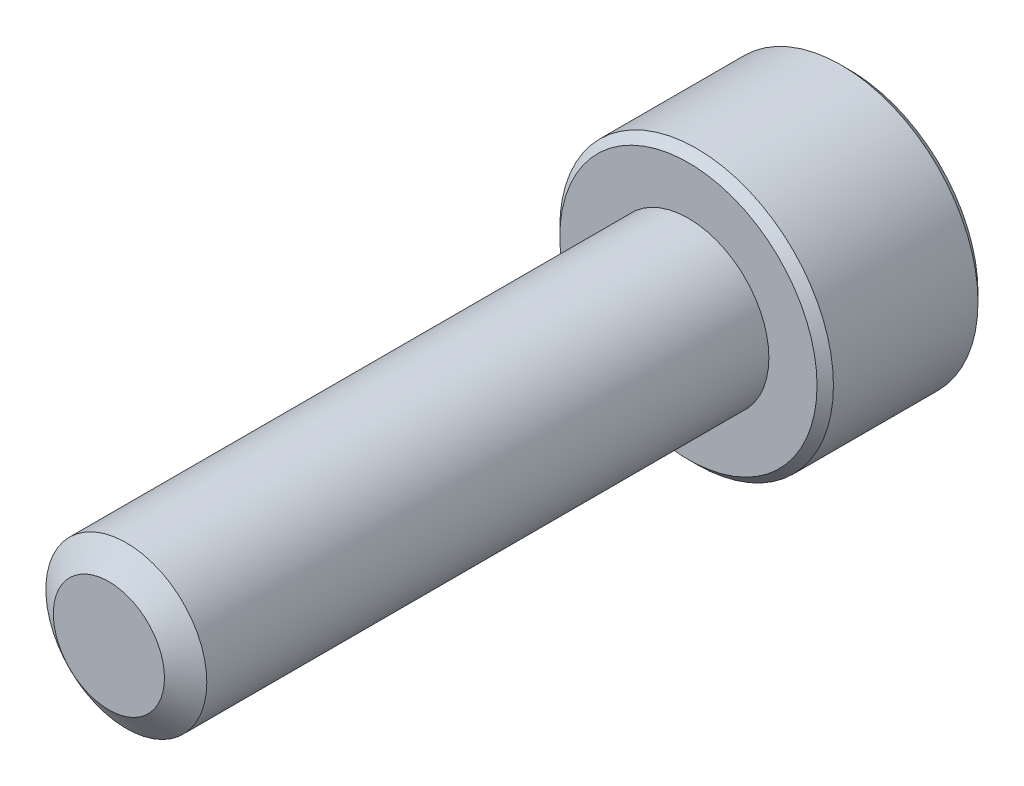
ISO-10303-21;
HEADER;
FILE_DESCRIPTION(('STEP AP214'),'2;1');
FILE_NAME('part.step','',(''),(''),'','','');
FILE_SCHEMA(('AUTOMOTIVE_DESIGN { 1 0 10303 214 1 1 1 1 }'));
ENDSEC;
DATA;
#1=APPLICATION_CONTEXT('core data for automotive mechanical design processes');
#2=APPLICATION_PROTOCOL_DEFINITION('international standard','automotive_design',2000,#1);
#3=PRODUCT_CONTEXT('',#1,'mechanical');
#4=PRODUCT('Part','Part','',(#3));
#5=PRODUCT_RELATED_PRODUCT_CATEGORY('part','',(#4));
#6=PRODUCT_DEFINITION_FORMATION('','',#4);
#7=PRODUCT_DEFINITION_CONTEXT('part definition',#1,'design');
#8=PRODUCT_DEFINITION('design','',#6,#7);
#9=PRODUCT_DEFINITION_SHAPE('','',#8);
#10=(LENGTH_UNIT() NAMED_UNIT(*) SI_UNIT(.MILLI.,.METRE.));
#11=(NAMED_UNIT(*) PLANE_ANGLE_UNIT() SI_UNIT($,.RADIAN.));
#12=(NAMED_UNIT(*) SI_UNIT($,.STERADIAN.) SOLID_ANGLE_UNIT());
#13=UNCERTAINTY_MEASURE_WITH_UNIT(LENGTH_MEASURE(1.E-05),#10,'distance_accuracy_value','');
#14=(GEOMETRIC_REPRESENTATION_CONTEXT(3) GLOBAL_UNCERTAINTY_ASSIGNED_CONTEXT((#13)) GLOBAL_UNIT_ASSIGNED_CONTEXT((#10,
#11,#12)) REPRESENTATION_CONTEXT('',''));
#15=CARTESIAN_POINT('',(0.,0.,0.));
#16=DIRECTION('',(0.,0.,1.));
#17=DIRECTION('',(1.,0.,0.));
#18=AXIS2_PLACEMENT_3D('',#15,#16,#17);
#19=CARTESIAN_POINT('',(0.,0.,-18.));
#20=DIRECTION('',(0.,0.,1.00000000000002));
#21=DIRECTION('',(1.00000000000003,0.,0.));
#22=AXIS2_PLACEMENT_3D('',#19,#20,#21);
#23=CYLINDRICAL_SURFACE('',#22,2.5);
#24=CARTESIAN_POINT('',(0.,0.,-0.541691224311913));
#25=DIRECTION('',(0.,0.,1.00000000000002));
#26=DIRECTION('',(1.00000000000003,0.,0.));
#27=AXIS2_PLACEMENT_3D('',#24,#25,#26);
#28=CIRCLE('',#27,2.5);
#29=CARTESIAN_POINT('',(2.50000000000008,0.,-0.541691224311913));
#30=VERTEX_POINT('',#29);
#31=EDGE_CURVE('E122',#30,#30,#28,.T.);
#32=ORIENTED_EDGE('',*,*,#31,.F.);
#33=EDGE_LOOP('',(#32));
#34=FACE_BOUND('',#33,.T.);
#35=CARTESIAN_POINT('',(0.,0.,-18.));
#36=DIRECTION('',(0.,0.,-1.00000000000002));
#37=DIRECTION('',(-1.00000000000003,0.,0.));
#38=AXIS2_PLACEMENT_3D('',#35,#36,#37);
#39=CIRCLE('',#38,2.5);
#40=CARTESIAN_POINT('',(-2.50000000000008,0.,-18.));
#41=VERTEX_POINT('',#40);
#42=EDGE_CURVE('E228',#41,#41,#39,.F.);
#43=ORIENTED_EDGE('',*,*,#42,.T.);
#44=EDGE_LOOP('',(#43));
#45=FACE_BOUND('',#44,.T.);
#46=ADVANCED_FACE('F48',(#34,#45),#23,.T.);
#47=CARTESIAN_POINT('',(0.,0.,0.));
#48=DIRECTION('',(0.,0.,-1.00000000000002));
#49=DIRECTION('',(-1.00000000000003,0.,0.));
#50=AXIS2_PLACEMENT_3D('',#47,#48,#49);
#51=CONICAL_SURFACE('',#50,1.72638475772933,0.959931088596884);
#52=ORIENTED_EDGE('',*,*,#31,.T.);
#53=EDGE_LOOP('',(#52));
#54=FACE_BOUND('',#53,.T.);
#55=CARTESIAN_POINT('',(0.,0.,0.));
#56=DIRECTION('',(0.,0.,1.00000000000002));
#57=DIRECTION('',(1.00000000000003,0.,0.));
#58=AXIS2_PLACEMENT_3D('',#55,#56,#57);
#59=CIRCLE('',#58,1.72638475772933);
#60=CARTESIAN_POINT('',(1.72638475772939,0.,0.));
#61=VERTEX_POINT('',#60);
#62=EDGE_CURVE('E226',#61,#61,#59,.T.);
#63=ORIENTED_EDGE('',*,*,#62,.F.);
#64=EDGE_LOOP('',(#63));
#65=FACE_BOUND('',#64,.T.);
#66=ADVANCED_FACE('F209',(#54,#65),#51,.T.);
#67=CARTESIAN_POINT('',(0.,0.,0.));
#68=DIRECTION('',(0.,0.,1.00000000000002));
#69=DIRECTION('',(1.00000000000003,0.,0.));
#70=AXIS2_PLACEMENT_3D('',#67,#68,#69);
#71=PLANE('',#70);
#72=ORIENTED_EDGE('',*,*,#62,.T.);
#73=EDGE_LOOP('',(#72));
#74=FACE_BOUND('',#73,.T.);
#75=ADVANCED_FACE('F206',(#74),#71,.T.);
#76=CARTESIAN_POINT('',(0.,0.,-22.9999999999999));
#77=DIRECTION('',(0.,0.,1.00000000000002));
#78=DIRECTION('',(1.00000000000003,0.,0.));
#79=AXIS2_PLACEMENT_3D('',#76,#77,#78);
#80=CYLINDRICAL_SURFACE('',#79,4.25);
#81=CARTESIAN_POINT('',(0.,0.,-22.745));
#82=DIRECTION('',(0.,0.,-1.00000000000002));
#83=DIRECTION('',(-1.00000000000003,0.,0.));
#84=AXIS2_PLACEMENT_3D('',#81,#82,#83);
#85=CIRCLE('',#84,4.25);
#86=CARTESIAN_POINT('',(-4.25000000000013,0.,-22.745));
#87=VERTEX_POINT('',#86);
#88=EDGE_CURVE('E56',#87,#87,#85,.F.);
#89=ORIENTED_EDGE('',*,*,#88,.T.);
#90=EDGE_LOOP('',(#89));
#91=FACE_BOUND('',#90,.T.);
#92=CARTESIAN_POINT('',(0.,0.,-18.2550000000001));
#93=DIRECTION('',(0.,0.,-1.00000000000002));
#94=DIRECTION('',(-1.00000000000003,0.,0.));
#95=AXIS2_PLACEMENT_3D('',#92,#93,#94);
#96=CIRCLE('',#95,4.25);
#97=CARTESIAN_POINT('',(-4.25000000000013,0.,-18.2550000000001));
#98=VERTEX_POINT('',#97);
#99=EDGE_CURVE('E185',#98,#98,#96,.T.);
#100=ORIENTED_EDGE('',*,*,#99,.T.);
#101=EDGE_LOOP('',(#100));
#102=FACE_BOUND('',#101,.T.);
#103=ADVANCED_FACE('F190',(#91,#102),#80,.T.);
#104=CARTESIAN_POINT('',(0.,0.,-22.9999999999999));
#105=DIRECTION('',(0.,0.,-1.00000000000002));
#106=DIRECTION('',(-1.00000000000003,0.,0.));
#107=AXIS2_PLACEMENT_3D('',#104,#105,#106);
#108=PLANE('',#107);
#109=CARTESIAN_POINT('',(0.,0.,-22.9999999999999));
#110=DIRECTION('',(0.,0.,-1.00000000000002));
#111=DIRECTION('',(-1.00000000000003,0.,0.));
#112=AXIS2_PLACEMENT_3D('',#109,#110,#111);
#113=CIRCLE('',#112,3.995);
#114=CARTESIAN_POINT('',(-3.99500000000012,0.,-22.9999999999999));
#115=VERTEX_POINT('',#114);
#116=EDGE_CURVE('E121',#115,#115,#113,.T.);
#117=ORIENTED_EDGE('',*,*,#116,.T.);
#118=EDGE_LOOP('',(#117));
#119=FACE_BOUND('',#118,.T.);
#120=CARTESIAN_POINT('',(0.,0.,-22.9999999999999));
#121=DIRECTION('',(0.,0.,-1.00000000000002));
#122=DIRECTION('',(-1.00000000000003,0.,0.));
#123=AXIS2_PLACEMENT_3D('',#120,#121,#122);
#124=CIRCLE('',#123,2.3094010767585);
#125=CARTESIAN_POINT('',(-2.00000000000034,1.15470053837974,-23.0000000000001));
#126=VERTEX_POINT('',#125);
#127=CARTESIAN_POINT('',(-1.87350135405495E-13,2.30940107675853,-23.0000000000001));
#128=VERTEX_POINT('',#127);
#129=EDGE_CURVE('E102',#126,#128,#124,.T.);
#130=ORIENTED_EDGE('',*,*,#129,.F.);
#131=CARTESIAN_POINT('',(-2.00000000000039,-1.15470053837879,-23.0000000000001));
#132=VERTEX_POINT('',#131);
#133=EDGE_CURVE('E62',#132,#126,#124,.T.);
#134=ORIENTED_EDGE('',*,*,#133,.F.);
#135=CARTESIAN_POINT('',(0.,-2.30940107675859,-22.9999999999999));
#136=VERTEX_POINT('',#135);
#137=EDGE_CURVE('E288',#136,#132,#124,.T.);
#138=ORIENTED_EDGE('',*,*,#137,.F.);
#139=CARTESIAN_POINT('',(1.99999999999984,-1.15470053837946,-22.9999999999999));
#140=VERTEX_POINT('',#139);
#141=EDGE_CURVE('E69',#140,#136,#124,.T.);
#142=ORIENTED_EDGE('',*,*,#141,.F.);
#143=CARTESIAN_POINT('',(2.00000000000039,1.15470053837963,-22.9999999999999));
#144=VERTEX_POINT('',#143);
#145=EDGE_CURVE('E143',#144,#140,#124,.T.);
#146=ORIENTED_EDGE('',*,*,#145,.F.);
#147=EDGE_CURVE('E111',#128,#144,#124,.T.);
#148=ORIENTED_EDGE('',*,*,#147,.F.);
#149=EDGE_LOOP('',(#130,#134,#138,#142,#146,#148));
#150=FACE_BOUND('',#149,.T.);
#151=ADVANCED_FACE('F142',(#119,#150),#108,.T.);
#152=CARTESIAN_POINT('',(0.,0.,-18.));
#153=DIRECTION('',(0.,0.,-1.00000000000002));
#154=DIRECTION('',(-1.00000000000003,0.,0.));
#155=AXIS2_PLACEMENT_3D('',#152,#153,#154);
#156=PLANE('',#155);
#157=CARTESIAN_POINT('',(0.,0.,-18.));
#158=DIRECTION('',(0.,0.,-1.00000000000002));
#159=DIRECTION('',(-1.00000000000003,0.,0.));
#160=AXIS2_PLACEMENT_3D('',#157,#158,#159);
#161=CIRCLE('',#160,3.995);
#162=CARTESIAN_POINT('',(-3.99500000000012,0.,-18.));
#163=VERTEX_POINT('',#162);
#164=EDGE_CURVE('E13',#163,#163,#161,.F.);
#165=ORIENTED_EDGE('',*,*,#164,.T.);
#166=EDGE_LOOP('',(#165));
#167=FACE_BOUND('',#166,.T.);
#168=ORIENTED_EDGE('',*,*,#42,.F.);
#169=EDGE_LOOP('',(#168));
#170=FACE_BOUND('',#169,.T.);
#171=ADVANCED_FACE('F199',(#167,#170),#156,.F.);
#172=CARTESIAN_POINT('',(0.,0.,-22.9999999999999));
#173=DIRECTION('',(0.,0.,-1.00000000000002));
#174=DIRECTION('',(-1.00000000000003,0.,0.));
#175=AXIS2_PLACEMENT_3D('',#172,#173,#174);
#176=CONICAL_SURFACE('',#175,2.3094010767585,0.78539816339745);
#177=ORIENTED_EDGE('',*,*,#147,.T.);
#178=CARTESIAN_POINT('',(-0.000200000000019629,2.30951654681244,-23.0001154787136));
#179=CARTESIAN_POINT('',(0.0685530340306484,2.26982196410712,-22.9604530902255));
#180=CARTESIAN_POINT('',(0.138455742135458,2.22946361676568,-22.923119982284));
#181=CARTESIAN_POINT('',(0.280995244550397,2.14716839667623,-22.854763685136));
#182=CARTESIAN_POINT('',(0.353645597565329,2.10522369580635,-22.8237785337371));
#183=CARTESIAN_POINT('',(0.500141601053941,2.02064418875699,-22.770700216544));
#184=CARTESIAN_POINT('',(0.573949935246253,1.97803092714262,-22.7484736271764));
#185=CARTESIAN_POINT('',(0.723191631835253,1.89186619344265,-22.714228816675));
#186=CARTESIAN_POINT('',(0.798620433918182,1.84831735425544,-22.7021850291442));
#187=CARTESIAN_POINT('',(0.92861550067108,1.77326466747233,-22.6913185119056));
#188=CARTESIAN_POINT('',(0.983013783970051,1.7418578039662,-22.6897097536099));
#189=CARTESIAN_POINT('',(1.09172145551951,1.67909540053412,-22.6924188775985));
#190=CARTESIAN_POINT('',(1.1460308059211,1.64773988246024,-22.6967388377578));
#191=CARTESIAN_POINT('',(1.25413672758901,1.58532489948431,-22.7110595674097));
#192=CARTESIAN_POINT('',(1.30793265655444,1.55426580541486,-22.7210666927617));
#193=CARTESIAN_POINT('',(1.41459426230504,1.49268469862243,-22.7462124302495));
#194=CARTESIAN_POINT('',(1.46746001007003,1.46216264491925,-22.7613506490422));
#195=CARTESIAN_POINT('',(1.60287973308915,1.38397803138048,-22.8062945034293));
#196=CARTESIAN_POINT('',(1.68459383484907,1.33680037273305,-22.8394888394256));
#197=CARTESIAN_POINT('',(1.8047470372576,1.26742988897858,-22.8955258231711));
#198=CARTESIAN_POINT('',(1.844342852109,1.24456923461532,-22.9152147029467));
#199=CARTESIAN_POINT('',(1.92280095888774,1.19927142554648,-22.9563873183647));
#200=CARTESIAN_POINT('',(1.96166368359364,1.17683402097609,-22.9778699516511));
#201=CARTESIAN_POINT('',(2.00019999999995,1.15458506832539,-23.0001154787136));
#202=B_SPLINE_CURVE_WITH_KNOTS('',3,(#178,#179,#180,#181,#182,#183,#184,#185,#186,#187,#188,
#189,#190,#191,#192,#193,#194,#195,#196,#197,#198,#199,#200,#201),.UNSPECIFIED.,.F.,.F.,(4,2,2,
2,2,2,2,2,2,2,2,4),(0.,0.266420613771173,0.534393751523506,0.798110374377025,1.06116288956953,
1.24939906803721,1.43770123566227,1.62621426093892,1.81471283831858,2.11415604834122,
2.26347170717781,2.41269626969778),.UNSPECIFIED.);
#203=EDGE_CURVE('E116',#128,#144,#202,.T.);
#204=ORIENTED_EDGE('',*,*,#203,.F.);
#205=EDGE_LOOP('',(#177,#204));
#206=FACE_BOUND('',#205,.T.);
#207=ADVANCED_FACE('F117',(#206),#176,.F.);
#208=ORIENTED_EDGE('',*,*,#145,.T.);
#209=CARTESIAN_POINT('',(2.00000000000056,-2.30294417292876,-23.7407713550277));
#210=CARTESIAN_POINT('',(2.00000000000046,-2.24687002663673,-23.6984432736259));
#211=CARTESIAN_POINT('',(2.00000000000042,-2.19048190536925,-23.6565251568643));
#212=CARTESIAN_POINT('',(2.00000000000039,-2.07695390496396,-23.573690417861));
#213=CARTESIAN_POINT('',(2.0000000000004,-2.01981384066427,-23.5327740496681));
#214=CARTESIAN_POINT('',(2.00000000000041,-1.90424016804749,-23.4518334520186));
#215=CARTESIAN_POINT('',(2.00000000000041,-1.84579996743883,-23.4118185915599));
#216=CARTESIAN_POINT('',(2.0000000000004,-1.72792745461734,-23.3332889936643));
#217=CARTESIAN_POINT('',(2.00000000000039,-1.66849521292297,-23.2947741502432));
#218=CARTESIAN_POINT('',(2.00000000000043,-1.48162995709994,-23.1776406516044));
#219=CARTESIAN_POINT('',(2.00000000000055,-1.35220318163508,-23.1021459017299));
#220=CARTESIAN_POINT('',(2.00000000000026,-1.08689521592921,-22.9640493509944));
#221=CARTESIAN_POINT('',(1.99999999999986,-0.951037763938428,-22.9014040859031));
#222=CARTESIAN_POINT('',(2.00000000000013,-0.747111912259644,-22.8247635438751));
#223=CARTESIAN_POINT('',(2.00000000000034,-0.682064034148044,-22.8027671799194));
#224=CARTESIAN_POINT('',(2.00000000000047,-0.550398103294886,-22.7639966876606));
#225=CARTESIAN_POINT('',(2.00000000000039,-0.483779942722642,-22.7472229191215));
#226=CARTESIAN_POINT('',(2.00000000000041,-0.350484328847851,-22.7200482578848));
#227=CARTESIAN_POINT('',(2.00000000000052,-0.283829489364979,-22.7095381767421));
#228=CARTESIAN_POINT('',(2.00000000000028,-0.149806987139598,-22.6950960855452));
#229=CARTESIAN_POINT('',(1.99999999999994,-0.0824394489343734,-22.6911629447331));
#230=CARTESIAN_POINT('',(1.99999999999995,0.0499055622941836,-22.6901664769337));
#231=CARTESIAN_POINT('',(2.00000000000027,0.114881285142841,-22.6928596448506));
#232=CARTESIAN_POINT('',(2.00000000000052,0.244275921482402,-22.704430070423));
#233=CARTESIAN_POINT('',(2.00000000000045,0.308694780266391,-22.7133079288335));
#234=CARTESIAN_POINT('',(2.00000000000034,0.437599788610327,-22.7369136592964));
#235=CARTESIAN_POINT('',(2.00000000000029,0.502067428644204,-22.7517410834467));
#236=CARTESIAN_POINT('',(2.0000000000005,0.629594322597912,-22.7864578836281));
#237=CARTESIAN_POINT('',(2.00000000000076,0.692653693882768,-22.8063468361063));
#238=CARTESIAN_POINT('',(2.0000000000011,0.891187889210211,-22.8764469792561));
#239=CARTESIAN_POINT('',(2.00000000000058,1.02383545707271,-22.9346418003215));
#240=CARTESIAN_POINT('',(2.0000000000002,1.28290932150043,-23.0640305754597));
#241=CARTESIAN_POINT('',(2.00000000000035,1.40931112587545,-23.1352712314149));
#242=CARTESIAN_POINT('',(2.0000000000004,1.59200441438946,-23.2464419918748));
#243=CARTESIAN_POINT('',(2.00000000000039,1.65027549026176,-23.2831821903375));
#244=CARTESIAN_POINT('',(2.00000000000038,1.76581760389234,-23.3582145141839));
#245=CARTESIAN_POINT('',(2.00000000000038,1.82308856543099,-23.3965067571182));
#246=CARTESIAN_POINT('',(2.00000000000039,1.93629654762082,-23.4740422640814));
#247=CARTESIAN_POINT('',(2.00000000000041,1.99224062500538,-23.5132752761338));
#248=CARTESIAN_POINT('',(2.00000000000036,2.10336424029903,-23.5927788307367));
#249=CARTESIAN_POINT('',(2.0000000000003,2.15854398422474,-23.6330490850007));
#250=CARTESIAN_POINT('',(2.00000000000016,2.21340370692669,-23.6737442381461));
#251=B_SPLINE_CURVE_WITH_KNOTS('',3,(#209,#210,#211,#212,#213,#214,#215,#216,#217,#218,#219,
#220,#221,#222,#223,#224,#225,#226,#227,#228,#229,#230,#231,#232,#233,#234,#235,#236,#237,#238,
#239,#240,#241,#242,#243,#244,#245,#246,#247,#248,#249,#250),.UNSPECIFIED.,.F.,.F.,(4,2,2,2,2,2,
2,2,2,2,2,2,2,2,2,2,2,2,2,2,4),(0.,0.210772731976795,0.421598374658408,0.634057554623307,
0.846501695869978,1.29562155455591,1.74319622821586,1.94902062110141,2.15485918928257,
2.35699582502565,2.55909770432064,2.75388435553474,2.9486899301473,3.14690093452498,
3.34509535789608,3.77838155837567,4.21325029921552,4.41989056685582,4.62654651460865,
4.83152377111238,5.03644465914038),.UNSPECIFIED.);
#252=EDGE_CURVE('E110',#144,#140,#251,.F.);
#253=ORIENTED_EDGE('',*,*,#252,.F.);
#254=EDGE_LOOP('',(#208,#253));
#255=FACE_BOUND('',#254,.T.);
#256=ADVANCED_FACE('F294',(#255),#176,.F.);
#257=ORIENTED_EDGE('',*,*,#141,.T.);
#258=CARTESIAN_POINT('',(2.00019999999972,-1.15458506832544,-23.0001154787136));
#259=CARTESIAN_POINT('',(1.93144696596913,-1.19427965103075,-22.9604530902255));
#260=CARTESIAN_POINT('',(1.86154425786439,-1.23463799837218,-22.9231199822841));
#261=CARTESIAN_POINT('',(1.71900475544957,-1.31693321846159,-22.8547636851361));
#262=CARTESIAN_POINT('',(1.64635440243467,-1.35887791933145,-22.8237785337372));
#263=CARTESIAN_POINT('',(1.49985839894612,-1.44345742638074,-22.7707002165442));
#264=CARTESIAN_POINT('',(1.42605006475382,-1.48607068799508,-22.7484736271766));
#265=CARTESIAN_POINT('',(1.27680836816495,-1.57223542169506,-22.7142288166751));
#266=CARTESIAN_POINT('',(1.20137956608215,-1.61578426088232,-22.7021850291442));
#267=CARTESIAN_POINT('',(1.0713844993292,-1.69083694766542,-22.6913185119056));
#268=CARTESIAN_POINT('',(1.01698621603011,-1.72224381117152,-22.68970975361));
#269=CARTESIAN_POINT('',(0.908278544480439,-1.78500621460365,-22.6924188775987));
#270=CARTESIAN_POINT('',(0.853969194078775,-1.8163617326776,-22.696738837758));
#271=CARTESIAN_POINT('',(0.745863272410703,-1.87877671565363,-22.7110595674099));
#272=CARTESIAN_POINT('',(0.692067343445193,-1.90983580972311,-22.721066692762));
#273=CARTESIAN_POINT('',(0.58540573769441,-1.97141691651567,-22.7462124302497));
#274=CARTESIAN_POINT('',(0.532539989929326,-2.00193897021897,-22.7613506490422));
#275=CARTESIAN_POINT('',(0.397120266910225,-2.08012358375775,-22.8062945034292));
#276=CARTESIAN_POINT('',(0.315406165150466,-2.12730124240499,-22.8394888394259));
#277=CARTESIAN_POINT('',(0.195252962742123,-2.19667172615935,-22.8955258231714));
#278=CARTESIAN_POINT('',(0.155657147890769,-2.2195323805226,-22.915214702947));
#279=CARTESIAN_POINT('',(0.0771990411120734,-2.26483018959138,-22.9563873183649));
#280=CARTESIAN_POINT('',(0.038336316406183,-2.28726759416173,-22.9778699516513));
#281=CARTESIAN_POINT('',(-0.000200000000172285,-2.30951654681233,-23.0001154787136));
#282=B_SPLINE_CURVE_WITH_KNOTS('',3,(#258,#259,#260,#261,#262,#263,#264,#265,#266,#267,#268,
#269,#270,#271,#272,#273,#274,#275,#276,#277,#278,#279,#280,#281),.UNSPECIFIED.,.F.,.F.,(4,2,2,
2,2,2,2,2,2,2,2,4),(0.,0.266420613770934,0.534393751523119,0.798110374376522,1.06116288956885,
1.24939906803681,1.43770123566218,1.62621426093913,1.81471283831906,2.11415604834134,
2.26347170717778,2.41269626969756),.UNSPECIFIED.);
#283=EDGE_CURVE('E153',#140,#136,#282,.T.);
#284=ORIENTED_EDGE('',*,*,#283,.F.);
#285=EDGE_LOOP('',(#257,#284));
#286=FACE_BOUND('',#285,.T.);
#287=ADVANCED_FACE('F291',(#286),#176,.F.);
#288=ORIENTED_EDGE('',*,*,#137,.T.);
#289=CARTESIAN_POINT('',(0.000200000000394329,-2.30951654681255,-23.0001154787136));
#290=CARTESIAN_POINT('',(-0.0685530340304105,-2.26982196410732,-22.9604530902256));
#291=CARTESIAN_POINT('',(-0.138455742135281,-2.22946361676592,-22.9231199822842));
#292=CARTESIAN_POINT('',(-0.280995244550291,-2.1471683966765,-22.8547636851362));
#293=CARTESIAN_POINT('',(-0.353645597565234,-2.1052236958066,-22.8237785337373));
#294=CARTESIAN_POINT('',(-0.500141601053892,-2.02064418875718,-22.7707002165442));
#295=CARTESIAN_POINT('',(-0.57394993524624,-1.97803092714274,-22.7484736271766));
#296=CARTESIAN_POINT('',(-0.723191631835358,-1.89186619344282,-22.7142288166751));
#297=CARTESIAN_POINT('',(-0.798620433918368,-1.84831735425571,-22.7021850291442));
#298=CARTESIAN_POINT('',(-0.928615500671342,-1.77326466747249,-22.6913185119056));
#299=CARTESIAN_POINT('',(-0.983013783970339,-1.74185780396624,-22.68970975361));
#300=CARTESIAN_POINT('',(-1.09172145551994,-1.67909540053402,-22.6924188775987));
#301=CARTESIAN_POINT('',(-1.14603080592163,-1.64773988246014,-22.696738837758));
#302=CARTESIAN_POINT('',(-1.25413672758966,-1.58532489948409,-22.71105956741));
#303=CARTESIAN_POINT('',(-1.3079326565551,-1.55426580541452,-22.7210666927621));
#304=CARTESIAN_POINT('',(-1.41459426230599,-1.49268469862219,-22.7462124302497));
#305=CARTESIAN_POINT('',(-1.46746001007126,-1.46216264491922,-22.7613506490422));
#306=CARTESIAN_POINT('',(-1.60287973309041,-1.38397803138067,-22.8062945034292));
#307=CARTESIAN_POINT('',(-1.68459383484982,-1.33680037273295,-22.8394888394259));
#308=CARTESIAN_POINT('',(-1.80474703725799,-1.26742988897845,-22.8955258231714));
#309=CARTESIAN_POINT('',(-1.84434285210935,-1.24456923461525,-22.915214702947));
#310=CARTESIAN_POINT('',(-1.92280095888804,-1.19927142554654,-22.9563873183649));
#311=CARTESIAN_POINT('',(-1.96166368359392,-1.17683402097622,-22.9778699516512));
#312=CARTESIAN_POINT('',(-2.00020000000019,-1.15458506832555,-23.0001154787136));
#313=B_SPLINE_CURVE_WITH_KNOTS('',3,(#289,#290,#291,#292,#293,#294,#295,#296,#297,#298,#299,
#300,#301,#302,#303,#304,#305,#306,#307,#308,#309,#310,#311,#312),.UNSPECIFIED.,.F.,.F.,(4,2,2,
2,2,2,2,2,2,2,2,4),(0.,0.266420613771173,0.534393751523601,0.798110374377284,1.06116288956989,
1.24939906803783,1.43770123566317,1.62621426094009,1.81471283831997,2.11415604834209,
2.26347170717846,2.41269626969817),.UNSPECIFIED.);
#314=EDGE_CURVE('E265',#136,#132,#313,.T.);
#315=ORIENTED_EDGE('',*,*,#314,.F.);
#316=EDGE_LOOP('',(#288,#315));
#317=FACE_BOUND('',#316,.T.);
#318=ADVANCED_FACE('F290',(#317),#176,.F.);
#319=ORIENTED_EDGE('',*,*,#133,.T.);
#320=CARTESIAN_POINT('',(-2.00000000000017,-2.30294417326454,-23.7407713552806));
#321=CARTESIAN_POINT('',(-2.00000000000031,-2.24687002696289,-23.6984432738693));
#322=CARTESIAN_POINT('',(-2.00000000000036,-2.19048190568587,-23.656525157098));
#323=CARTESIAN_POINT('',(-2.00000000000041,-2.07695390526149,-23.5736904180753));
#324=CARTESIAN_POINT('',(-2.00000000000039,-2.01981384095226,-23.5327740498727));
#325=CARTESIAN_POINT('',(-2.00000000000038,-1.90424016831607,-23.4518334522037));
#326=CARTESIAN_POINT('',(-2.00000000000039,-1.84579996769754,-23.4118185917353));
#327=CARTESIAN_POINT('',(-2.00000000000039,-1.72792745485612,-23.3332889938204));
#328=CARTESIAN_POINT('',(-2.00000000000037,-1.6684952131517,-23.2947741503896));
#329=CARTESIAN_POINT('',(-2.00000000000042,-1.48162995729548,-23.1776406517203));
#330=CARTESIAN_POINT('',(-2.00000000000056,-1.35220318180705,-23.1021459018253));
#331=CARTESIAN_POINT('',(-2.00000000000022,-1.08689521605174,-22.9640493510523));
#332=CARTESIAN_POINT('',(-1.99999999999975,-0.951037764035109,-22.9014040859441));
#333=CARTESIAN_POINT('',(-2.00000000000007,-0.747111912337108,-22.8247635439029));
#334=CARTESIAN_POINT('',(-2.00000000000031,-0.68206403423366,-22.8027671799474));
#335=CARTESIAN_POINT('',(-2.00000000000048,-0.550398103396971,-22.7639966876878));
#336=CARTESIAN_POINT('',(-2.00000000000039,-0.483779942833043,-22.7472229191478));
#337=CARTESIAN_POINT('',(-2.0000000000004,-0.350484328974646,-22.720048257907));
#338=CARTESIAN_POINT('',(-2.00000000000048,-0.28382948949985,-22.7095381767613));
#339=CARTESIAN_POINT('',(-2.00000000000032,-0.149806987290334,-22.6950960855567));
#340=CARTESIAN_POINT('',(-2.00000000000007,-0.0824394490929,-22.69116294474));
#341=CARTESIAN_POINT('',(-2.00000000000008,0.0499055621213354,-22.6901664769297));
#342=CARTESIAN_POINT('',(-2.00000000000031,0.114881284963442,-22.6928596448405));
#343=CARTESIAN_POINT('',(-2.00000000000048,0.244275921290553,-22.7044300703999));
#344=CARTESIAN_POINT('',(-2.00000000000042,0.308694780068645,-22.7133079288034));
#345=CARTESIAN_POINT('',(-2.00000000000038,0.437599788400933,-22.7369136592517));
#346=CARTESIAN_POINT('',(-2.00000000000039,0.502067428429079,-22.7517410833945));
#347=CARTESIAN_POINT('',(-2.00000000000041,0.629594322371901,-22.7864578835603));
#348=CARTESIAN_POINT('',(-2.00000000000041,0.6926536936516,-22.8063468360306));
#349=CARTESIAN_POINT('',(-2.0000000000004,0.891187888928577,-22.8764469791433));
#350=CARTESIAN_POINT('',(-2.0000000000004,1.02383545674825,-22.9346418001748));
#351=CARTESIAN_POINT('',(-2.0000000000004,1.28290932109367,-23.0640305752412));
#352=CARTESIAN_POINT('',(-2.0000000000004,1.40931112542924,-23.1352712311585));
#353=CARTESIAN_POINT('',(-2.00000000000041,1.59200441388846,-23.2464419915629));
#354=CARTESIAN_POINT('',(-2.00000000000041,1.65027548974472,-23.2831821900085));
#355=CARTESIAN_POINT('',(-2.0000000000004,1.76581760334345,-23.3582145138207));
#356=CARTESIAN_POINT('',(-2.00000000000039,1.82308856486629,-23.3965067567378));
#357=CARTESIAN_POINT('',(-2.00000000000042,1.93629654702489,-23.4740422636669));
#358=CARTESIAN_POINT('',(-2.00000000000046,1.99224062439402,-23.5132752757023));
#359=CARTESIAN_POINT('',(-2.00000000000036,2.10336423965691,-23.5927788302714));
#360=CARTESIAN_POINT('',(-2.00000000000021,2.15854398356729,-23.6330490845185));
#361=CARTESIAN_POINT('',(-1.99999999999986,2.21340370625395,-23.6737442376469));
#362=B_SPLINE_CURVE_WITH_KNOTS('',3,(#320,#321,#322,#323,#324,#325,#326,#327,#328,#329,#330,
#331,#332,#333,#334,#335,#336,#337,#338,#339,#340,#341,#342,#343,#344,#345,#346,#347,#348,#349,
#350,#351,#352,#353,#354,#355,#356,#357,#358,#359,#360,#361),.UNSPECIFIED.,.F.,.F.,(4,2,2,2,2,2,
2,2,2,2,2,2,2,2,2,2,2,2,2,2,4),(0.,0.210772732017061,0.421598374738942,0.6340575547448,
0.846501696032432,1.29562155481039,1.74319622856159,1.9490206214238,2.15485918958162,
2.3569958253023,2.55909770457491,2.75388435576871,2.94868993036093,3.14690093471673,
3.34509535806596,3.77838155838765,4.21325029906857,4.41989056664085,4.62654651432567,
4.8315237707623,5.03644465872319),.UNSPECIFIED.);
#363=EDGE_CURVE('E132',#132,#126,#362,.T.);
#364=ORIENTED_EDGE('',*,*,#363,.F.);
#365=EDGE_LOOP('',(#319,#364));
#366=FACE_BOUND('',#365,.T.);
#367=ADVANCED_FACE('F303',(#366),#176,.F.);
#368=ORIENTED_EDGE('',*,*,#129,.T.);
#369=CARTESIAN_POINT('',(-2.0001999999999,1.15458506832555,-23.0001154787136));
#370=CARTESIAN_POINT('',(-1.93144696596938,1.19427965103127,-22.9604530902259));
#371=CARTESIAN_POINT('',(-1.86154425786465,1.23463799837279,-22.9231199822846));
#372=CARTESIAN_POINT('',(-1.71900475544977,1.31693321846227,-22.8547636851367));
#373=CARTESIAN_POINT('',(-1.6463544024348,1.35887791933209,-22.8237785337377));
#374=CARTESIAN_POINT('',(-1.49985839894621,1.44345742638153,-22.7707002165448));
#375=CARTESIAN_POINT('',(-1.42605006475395,1.48607068799607,-22.7484736271774));
#376=CARTESIAN_POINT('',(-1.27680836816483,1.57223542169562,-22.7142288166755));
#377=CARTESIAN_POINT('',(-1.20137956608173,1.61578426088226,-22.7021850291441));
#378=CARTESIAN_POINT('',(-1.07138449932898,1.69083694766553,-22.6913185119057));
#379=CARTESIAN_POINT('',(-1.01698621603018,1.72224381117206,-22.6897097536105));
#380=CARTESIAN_POINT('',(-0.908278544480735,1.78500621460445,-22.6924188775995));
#381=CARTESIAN_POINT('',(-0.853969194079002,1.81636173267823,-22.6967388377587));
#382=CARTESIAN_POINT('',(-0.745863272411016,1.87877671565425,-22.7110595674106));
#383=CARTESIAN_POINT('',(-0.692067343445664,1.9098358097239,-22.7210666927628));
#384=CARTESIAN_POINT('',(-0.585405737694652,1.97141691651604,-22.7462124302502));
#385=CARTESIAN_POINT('',(-0.532539989929179,2.00193897021874,-22.7613506490424));
#386=CARTESIAN_POINT('',(-0.397120266909919,2.08012358375711,-22.806294503429));
#387=CARTESIAN_POINT('',(-0.315406165150898,2.12730124240517,-22.8394888394262));
#388=CARTESIAN_POINT('',(-0.195252962742915,2.19667172615985,-22.895525823172));
#389=CARTESIAN_POINT('',(-0.155657147891552,2.21953238052305,-22.9152147029475));
#390=CARTESIAN_POINT('',(-0.0771990411127383,2.26483018959164,-22.9563873183652));
#391=CARTESIAN_POINT('',(-0.0383363164067397,2.28726759416184,-22.9778699516514));
#392=CARTESIAN_POINT('',(0.000199999999721256,2.30951654681233,-23.0001154787136));
#393=B_SPLINE_CURVE_WITH_KNOTS('',3,(#369,#370,#371,#372,#373,#374,#375,#376,#377,#378,#379,
#380,#381,#382,#383,#384,#385,#386,#387,#388,#389,#390,#391,#392),.UNSPECIFIED.,.F.,.F.,(4,2,2,
2,2,2,2,2,2,2,2,4),(0.,0.26642061377085,0.534393751523224,0.798110374376755,1.06116288956907,
1.24939906803686,1.43770123566215,1.62621426093901,1.81471283831876,2.11415604834084,
2.26347170717722,2.41269626969687),.UNSPECIFIED.);
#394=EDGE_CURVE('E106',#126,#128,#393,.T.);
#395=ORIENTED_EDGE('',*,*,#394,.F.);
#396=EDGE_LOOP('',(#368,#395));
#397=FACE_BOUND('',#396,.T.);
#398=ADVANCED_FACE('F104',(#397),#176,.F.);
#399=CARTESIAN_POINT('',(1.99999999999995,3.46410161513772,-20.));
#400=DIRECTION('',(0.,0.,-1.00000000000002));
#401=DIRECTION('',(-1.00000000000003,0.,0.));
#402=AXIS2_PLACEMENT_3D('',#399,#400,#401);
#403=PLANE('',#402);
#404=DIRECTION('',(0.866025403784469,0.500000000000014,0.));
#405=VECTOR('',#404,1.);
#406=CARTESIAN_POINT('',(-2.0000000000009,1.15470053837963,-20.));
#407=LINE('',#406,#405);
#408=CARTESIAN_POINT('',(-2.0000000000009,1.15470053837963,-20.));
#409=VERTEX_POINT('',#408);
#410=CARTESIAN_POINT('',(-1.94289029309402E-13,2.30940107675853,-20.));
#411=VERTEX_POINT('',#410);
#412=EDGE_CURVE('E131',#409,#411,#407,.T.);
#413=ORIENTED_EDGE('',*,*,#412,.T.);
#414=DIRECTION('',(0.866025403784463,-0.500000000000006,0.));
#415=VECTOR('',#414,1.);
#416=CARTESIAN_POINT('',(-1.94289029309402E-13,2.30940107675853,-20.));
#417=LINE('',#416,#415);
#418=CARTESIAN_POINT('',(2.00000000000039,1.15470053837963,-20.));
#419=VERTEX_POINT('',#418);
#420=EDGE_CURVE('E136',#411,#419,#417,.T.);
#421=ORIENTED_EDGE('',*,*,#420,.T.);
#422=DIRECTION('',(0.,-1.00000000000001,0.));
#423=VECTOR('',#422,1.);
#424=CARTESIAN_POINT('',(2.00000000000039,1.15470053837963,-20.));
#425=LINE('',#424,#423);
#426=CARTESIAN_POINT('',(1.99999999999984,-1.15470053837946,-20.));
#427=VERTEX_POINT('',#426);
#428=EDGE_CURVE('E251',#419,#427,#425,.T.);
#429=ORIENTED_EDGE('',*,*,#428,.T.);
#430=DIRECTION('',(-0.86602540378447,-0.500000000000014,0.));
#431=VECTOR('',#430,1.);
#432=CARTESIAN_POINT('',(1.99999999999984,-1.15470053837946,-20.));
#433=LINE('',#432,#431);
#434=CARTESIAN_POINT('',(0.,-2.30940107675859,-20.));
#435=VERTEX_POINT('',#434);
#436=EDGE_CURVE('E248',#427,#435,#433,.T.);
#437=ORIENTED_EDGE('',*,*,#436,.T.);
#438=DIRECTION('',(-0.866025403784463,0.500000000000006,0.));
#439=VECTOR('',#438,1.);
#440=CARTESIAN_POINT('',(0.,-2.30940107675859,-20.));
#441=LINE('',#440,#439);
#442=CARTESIAN_POINT('',(-2.00000000000039,-1.15470053837879,-20.));
#443=VERTEX_POINT('',#442);
#444=EDGE_CURVE('E245',#435,#443,#441,.T.);
#445=ORIENTED_EDGE('',*,*,#444,.T.);
#446=DIRECTION('',(0.,1.00000000000001,0.));
#447=VECTOR('',#446,1.);
#448=CARTESIAN_POINT('',(-2.00000000000039,-1.15470053837879,-20.));
#449=LINE('',#448,#447);
#450=EDGE_CURVE('E139',#443,#409,#449,.T.);
#451=ORIENTED_EDGE('',*,*,#450,.T.);
#452=EDGE_LOOP('',(#413,#421,#429,#437,#445,#451));
#453=FACE_BOUND('',#452,.T.);
#454=ADVANCED_FACE('F173',(#453),#403,.T.);
#455=CARTESIAN_POINT('',(-1.94289029309402E-13,2.30940107675853,-20.));
#456=DIRECTION('',(0.500000000000018,0.866025403784456,0.));
#457=DIRECTION('',(-0.866025403784463,0.500000000000006,0.));
#458=AXIS2_PLACEMENT_3D('',#455,#456,#457);
#459=PLANE('',#458);
#460=DIRECTION('',(0.,0.,-1.00000000000002));
#461=VECTOR('',#460,1.);
#462=CARTESIAN_POINT('',(-1.94289029309402E-13,2.30940107675853,-20.));
#463=LINE('',#462,#461);
#464=EDGE_CURVE('E128',#411,#128,#463,.T.);
#465=ORIENTED_EDGE('',*,*,#464,.T.);
#466=ORIENTED_EDGE('',*,*,#203,.T.);
#467=DIRECTION('',(0.,0.,-1.00000000000002));
#468=VECTOR('',#467,1.);
#469=CARTESIAN_POINT('',(2.00000000000039,1.15470053837963,-20.));
#470=LINE('',#469,#468);
#471=EDGE_CURVE('E138',#419,#144,#470,.T.);
#472=ORIENTED_EDGE('',*,*,#471,.F.);
#473=ORIENTED_EDGE('',*,*,#420,.F.);
#474=EDGE_LOOP('',(#465,#466,#472,#473));
#475=FACE_BOUND('',#474,.T.);
#476=ADVANCED_FACE('F134',(#475),#459,.F.);
#477=CARTESIAN_POINT('',(2.00000000000039,1.15470053837963,-20.));
#478=DIRECTION('',(1.00000000000003,0.,0.));
#479=DIRECTION('',(0.,0.,-1.00000000000002));
#480=AXIS2_PLACEMENT_3D('',#477,#478,#479);
#481=PLANE('',#480);
#482=ORIENTED_EDGE('',*,*,#471,.T.);
#483=ORIENTED_EDGE('',*,*,#252,.T.);
#484=DIRECTION('',(0.,0.,-1.00000000000002));
#485=VECTOR('',#484,1.);
#486=CARTESIAN_POINT('',(1.99999999999984,-1.15470053837946,-20.));
#487=LINE('',#486,#485);
#488=EDGE_CURVE('E234',#427,#140,#487,.T.);
#489=ORIENTED_EDGE('',*,*,#488,.F.);
#490=ORIENTED_EDGE('',*,*,#428,.F.);
#491=EDGE_LOOP('',(#482,#483,#489,#490));
#492=FACE_BOUND('',#491,.T.);
#493=ADVANCED_FACE('F162',(#492),#481,.F.);
#494=CARTESIAN_POINT('',(1.99999999999984,-1.15470053837946,-20.));
#495=DIRECTION('',(0.500000000000006,-0.866025403784447,0.));
#496=DIRECTION('',(0.86602540378447,0.500000000000014,0.));
#497=AXIS2_PLACEMENT_3D('',#494,#495,#496);
#498=PLANE('',#497);
#499=ORIENTED_EDGE('',*,*,#488,.T.);
#500=ORIENTED_EDGE('',*,*,#283,.T.);
#501=DIRECTION('',(0.,0.,-1.00000000000002));
#502=VECTOR('',#501,1.);
#503=CARTESIAN_POINT('',(0.,-2.30940107675859,-20.));
#504=LINE('',#503,#502);
#505=EDGE_CURVE('E237',#435,#136,#504,.T.);
#506=ORIENTED_EDGE('',*,*,#505,.F.);
#507=ORIENTED_EDGE('',*,*,#436,.F.);
#508=EDGE_LOOP('',(#499,#500,#506,#507));
#509=FACE_BOUND('',#508,.T.);
#510=ADVANCED_FACE('F166',(#509),#498,.F.);
#511=CARTESIAN_POINT('',(0.,-2.30940107675859,-20.));
#512=DIRECTION('',(-0.500000000000018,-0.866025403784456,0.));
#513=DIRECTION('',(0.866025403784463,-0.500000000000006,0.));
#514=AXIS2_PLACEMENT_3D('',#511,#512,#513);
#515=PLANE('',#514);
#516=ORIENTED_EDGE('',*,*,#505,.T.);
#517=ORIENTED_EDGE('',*,*,#314,.T.);
#518=DIRECTION('',(0.,0.,-1.00000000000002));
#519=VECTOR('',#518,1.);
#520=CARTESIAN_POINT('',(-2.00000000000039,-1.15470053837879,-20.));
#521=LINE('',#520,#519);
#522=EDGE_CURVE('E240',#443,#132,#521,.T.);
#523=ORIENTED_EDGE('',*,*,#522,.F.);
#524=ORIENTED_EDGE('',*,*,#444,.F.);
#525=EDGE_LOOP('',(#516,#517,#523,#524));
#526=FACE_BOUND('',#525,.T.);
#527=ADVANCED_FACE('F273',(#526),#515,.F.);
#528=CARTESIAN_POINT('',(-2.00000000000039,-1.15470053837879,-20.));
#529=DIRECTION('',(-1.00000000000003,0.,0.));
#530=DIRECTION('',(0.,-1.00000000000001,0.));
#531=AXIS2_PLACEMENT_3D('',#528,#529,#530);
#532=PLANE('',#531);
#533=ORIENTED_EDGE('',*,*,#522,.T.);
#534=ORIENTED_EDGE('',*,*,#363,.T.);
#535=DIRECTION('',(0.,0.,-1.00000000000002));
#536=VECTOR('',#535,1.);
#537=CARTESIAN_POINT('',(-2.0000000000009,1.15470053837963,-20.));
#538=LINE('',#537,#536);
#539=EDGE_CURVE('E130',#409,#126,#538,.T.);
#540=ORIENTED_EDGE('',*,*,#539,.F.);
#541=ORIENTED_EDGE('',*,*,#450,.F.);
#542=EDGE_LOOP('',(#533,#534,#540,#541));
#543=FACE_BOUND('',#542,.T.);
#544=ADVANCED_FACE('F270',(#543),#532,.F.);
#545=CARTESIAN_POINT('',(-2.0000000000009,1.15470053837963,-20.));
#546=DIRECTION('',(-0.500000000000006,0.866025403784447,0.));
#547=DIRECTION('',(-0.866025403784469,-0.500000000000014,0.));
#548=AXIS2_PLACEMENT_3D('',#545,#546,#547);
#549=PLANE('',#548);
#550=ORIENTED_EDGE('',*,*,#539,.T.);
#551=ORIENTED_EDGE('',*,*,#394,.T.);
#552=ORIENTED_EDGE('',*,*,#464,.F.);
#553=ORIENTED_EDGE('',*,*,#412,.F.);
#554=EDGE_LOOP('',(#550,#551,#552,#553));
#555=FACE_BOUND('',#554,.T.);
#556=ADVANCED_FACE('F126',(#555),#549,.F.);
#557=CARTESIAN_POINT('',(0.,0.,-22.9999999999999));
#558=DIRECTION('',(0.,0.,1.00000000000002));
#559=DIRECTION('',(1.00000000000003,0.,0.));
#560=AXIS2_PLACEMENT_3D('',#557,#558,#559);
#561=CONICAL_SURFACE('',#560,3.995,0.785398163397448);
#562=ORIENTED_EDGE('',*,*,#88,.F.);
#563=EDGE_LOOP('',(#562));
#564=FACE_BOUND('',#563,.T.);
#565=ORIENTED_EDGE('',*,*,#116,.F.);
#566=EDGE_LOOP('',(#565));
#567=FACE_BOUND('',#566,.T.);
#568=ADVANCED_FACE('F193',(#564,#567),#561,.T.);
#569=CARTESIAN_POINT('',(0.,0.,-18.2550000000001));
#570=DIRECTION('',(0.,0.,-1.00000000000002));
#571=DIRECTION('',(-1.00000000000003,0.,0.));
#572=AXIS2_PLACEMENT_3D('',#569,#570,#571);
#573=CONICAL_SURFACE('',#572,4.25,0.785398163397442);
#574=ORIENTED_EDGE('',*,*,#164,.F.);
#575=EDGE_LOOP('',(#574));
#576=FACE_BOUND('',#575,.T.);
#577=ORIENTED_EDGE('',*,*,#99,.F.);
#578=EDGE_LOOP('',(#577));
#579=FACE_BOUND('',#578,.T.);
#580=ADVANCED_FACE('F50',(#576,#579),#573,.T.);
#581=CLOSED_SHELL('',(#46,#66,#75,#103,#151,#171,#207,#256,#287,#318,#367,#398,#454,#476,#493,
#510,#527,#544,#556,#568,#580));
#582=MANIFOLD_SOLID_BREP('B2',#581);
#583=ADVANCED_BREP_SHAPE_REPRESENTATION('',(#18,#582),#14);
#584=SHAPE_DEFINITION_REPRESENTATION(#9,#583);
ENDSEC;
END-ISO-10303-21;
